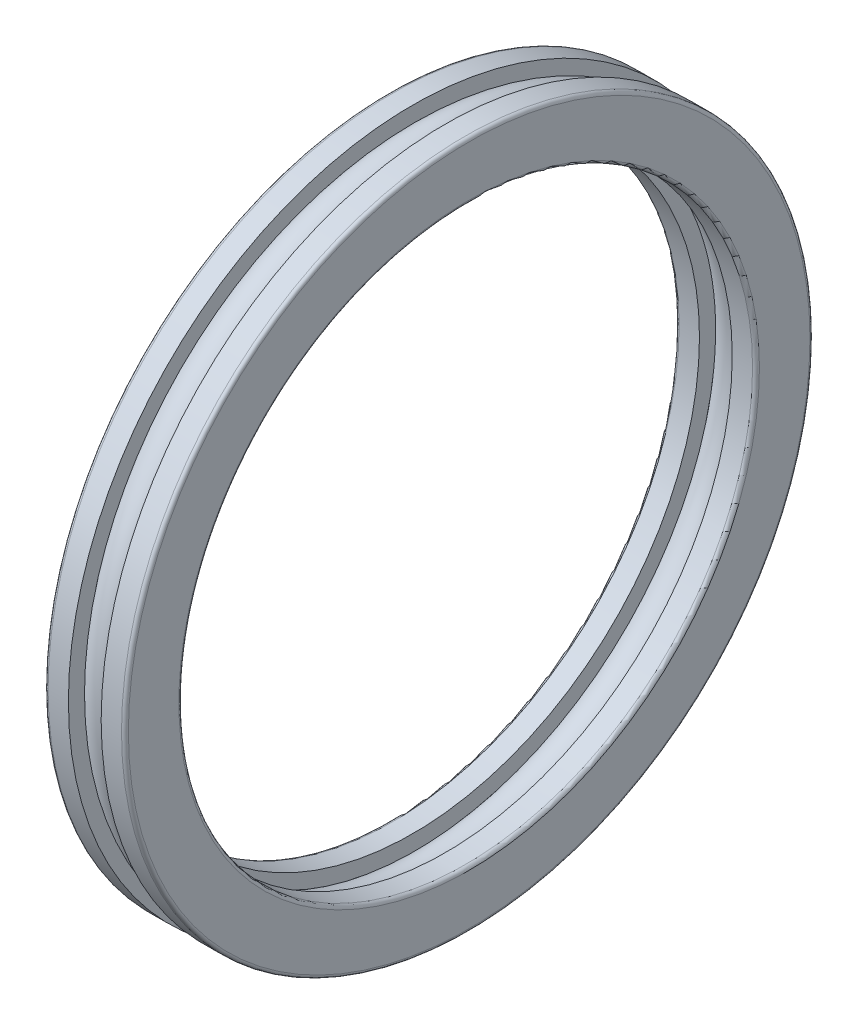
ISO-10303-21;
HEADER;
FILE_DESCRIPTION(('STEP AP214'),'2;1');
FILE_NAME('part.step','',(''),(''),'','','');
FILE_SCHEMA(('AUTOMOTIVE_DESIGN { 1 0 10303 214 1 1 1 1 }'));
ENDSEC;
DATA;
#1=APPLICATION_CONTEXT('core data for automotive mechanical design processes');
#2=APPLICATION_PROTOCOL_DEFINITION('international standard','automotive_design',2000,#1);
#3=PRODUCT_CONTEXT('',#1,'mechanical');
#4=PRODUCT('Part','Part','',(#3));
#5=PRODUCT_RELATED_PRODUCT_CATEGORY('part','',(#4));
#6=PRODUCT_DEFINITION_FORMATION('','',#4);
#7=PRODUCT_DEFINITION_CONTEXT('part definition',#1,'design');
#8=PRODUCT_DEFINITION('design','',#6,#7);
#9=PRODUCT_DEFINITION_SHAPE('','',#8);
#10=(LENGTH_UNIT() NAMED_UNIT(*) SI_UNIT(.MILLI.,.METRE.));
#11=(NAMED_UNIT(*) PLANE_ANGLE_UNIT() SI_UNIT($,.RADIAN.));
#12=(NAMED_UNIT(*) SI_UNIT($,.STERADIAN.) SOLID_ANGLE_UNIT());
#13=UNCERTAINTY_MEASURE_WITH_UNIT(LENGTH_MEASURE(1.E-05),#10,'distance_accuracy_value','');
#14=(GEOMETRIC_REPRESENTATION_CONTEXT(3) GLOBAL_UNCERTAINTY_ASSIGNED_CONTEXT((#13)) GLOBAL_UNIT_ASSIGNED_CONTEXT((#10,
#11,#12)) REPRESENTATION_CONTEXT('',''));
#15=CARTESIAN_POINT('',(0.,0.,0.));
#16=DIRECTION('',(0.,0.,1.));
#17=DIRECTION('',(1.,0.,0.));
#18=AXIS2_PLACEMENT_3D('',#15,#16,#17);
#19=CARTESIAN_POINT('',(0.,0.,0.));
#20=DIRECTION('',(-1.,0.,0.));
#21=DIRECTION('',(0.,0.,1.));
#22=AXIS2_PLACEMENT_3D('',#19,#20,#21);
#23=TOROIDAL_SURFACE('',#22,55.,3.57);
#24=CARTESIAN_POINT('',(2.856,0.,0.));
#25=DIRECTION('',(-1.,0.,0.));
#26=DIRECTION('',(0.,0.,1.));
#27=AXIS2_PLACEMENT_3D('',#24,#25,#26);
#28=CIRCLE('',#27,57.142);
#29=CARTESIAN_POINT('',(2.856,0.,57.142));
#30=VERTEX_POINT('',#29);
#31=EDGE_CURVE('E41',#30,#30,#28,.T.);
#32=ORIENTED_EDGE('',*,*,#31,.T.);
#33=EDGE_LOOP('',(#32));
#34=FACE_BOUND('',#33,.T.);
#35=CARTESIAN_POINT('',(-2.856,0.,0.));
#36=DIRECTION('',(1.,0.,0.));
#37=DIRECTION('',(0.,0.,-1.));
#38=AXIS2_PLACEMENT_3D('',#35,#36,#37);
#39=CIRCLE('',#38,57.142);
#40=CARTESIAN_POINT('',(-2.856,0.,-57.142));
#41=VERTEX_POINT('',#40);
#42=EDGE_CURVE('E56',#41,#41,#39,.F.);
#43=ORIENTED_EDGE('',*,*,#42,.F.);
#44=EDGE_LOOP('',(#43));
#45=FACE_BOUND('',#44,.T.);
#46=ADVANCED_FACE('F37',(#34,#45),#23,.T.);
#47=CARTESIAN_POINT('',(-2.856,52.8999311916035,0.));
#48=DIRECTION('',(1.,0.,0.));
#49=DIRECTION('',(0.,0.,-1.));
#50=AXIS2_PLACEMENT_3D('',#47,#48,#49);
#51=PLANE('',#50);
#52=CARTESIAN_POINT('',(-2.856,0.,0.));
#53=DIRECTION('',(1.,0.,0.));
#54=DIRECTION('',(0.,0.,-1.));
#55=AXIS2_PLACEMENT_3D('',#52,#53,#54);
#56=CIRCLE('',#55,50.);
#57=CARTESIAN_POINT('',(-2.856,0.,-50.));
#58=VERTEX_POINT('',#57);
#59=EDGE_CURVE('E75',#58,#58,#56,.T.);
#60=ORIENTED_EDGE('',*,*,#59,.F.);
#61=EDGE_LOOP('',(#60));
#62=FACE_BOUND('',#61,.T.);
#63=CARTESIAN_POINT('',(-2.856,0.,0.));
#64=DIRECTION('',(-1.,0.,0.));
#65=DIRECTION('',(0.,0.,1.));
#66=AXIS2_PLACEMENT_3D('',#63,#64,#65);
#67=CIRCLE('',#66,52.858);
#68=CARTESIAN_POINT('',(-2.856,0.,52.858));
#69=VERTEX_POINT('',#68);
#70=EDGE_CURVE('E54',#69,#69,#67,.F.);
#71=ORIENTED_EDGE('',*,*,#70,.T.);
#72=EDGE_LOOP('',(#71));
#73=FACE_BOUND('',#72,.T.);
#74=ADVANCED_FACE('F104',(#62,#73),#51,.T.);
#75=CARTESIAN_POINT('',(-2.856,60.,0.));
#76=DIRECTION('',(1.,0.,0.));
#77=DIRECTION('',(0.,0.,-1.));
#78=AXIS2_PLACEMENT_3D('',#75,#76,#77);
#79=PLANE('',#78);
#80=ORIENTED_EDGE('',*,*,#42,.T.);
#81=EDGE_LOOP('',(#80));
#82=FACE_BOUND('',#81,.T.);
#83=CARTESIAN_POINT('',(-2.856,0.,0.));
#84=DIRECTION('',(1.,0.,0.));
#85=DIRECTION('',(0.,0.,-1.));
#86=AXIS2_PLACEMENT_3D('',#83,#84,#85);
#87=CIRCLE('',#86,60.);
#88=CARTESIAN_POINT('',(-2.856,0.,-60.));
#89=VERTEX_POINT('',#88);
#90=EDGE_CURVE('E10',#89,#89,#87,.T.);
#91=ORIENTED_EDGE('',*,*,#90,.T.);
#92=EDGE_LOOP('',(#91));
#93=FACE_BOUND('',#92,.T.);
#94=ADVANCED_FACE('F39',(#82,#93),#79,.T.);
#95=CARTESIAN_POINT('',(-34.925,0.,0.));
#96=DIRECTION('',(1.,0.,0.));
#97=DIRECTION('',(0.,0.,-1.));
#98=AXIS2_PLACEMENT_3D('',#95,#96,#97);
#99=CYLINDRICAL_SURFACE('',#98,60.);
#100=CARTESIAN_POINT('',(-6.4,0.,0.));
#101=DIRECTION('',(1.,0.,0.));
#102=DIRECTION('',(0.,0.,-1.));
#103=AXIS2_PLACEMENT_3D('',#100,#101,#102);
#104=CIRCLE('',#103,60.);
#105=CARTESIAN_POINT('',(-6.4,0.,-60.));
#106=VERTEX_POINT('',#105);
#107=EDGE_CURVE('E45',#106,#106,#104,.T.);
#108=ORIENTED_EDGE('',*,*,#107,.T.);
#109=EDGE_LOOP('',(#108));
#110=FACE_BOUND('',#109,.T.);
#111=ORIENTED_EDGE('',*,*,#90,.F.);
#112=EDGE_LOOP('',(#111));
#113=FACE_BOUND('',#112,.T.);
#114=ADVANCED_FACE('F101',(#110,#113),#99,.T.);
#115=CARTESIAN_POINT('',(-6.4,0.,0.));
#116=DIRECTION('',(1.,0.,0.));
#117=DIRECTION('',(0.,0.,-1.));
#118=AXIS2_PLACEMENT_3D('',#115,#116,#117);
#119=TOROIDAL_SURFACE('',#118,59.4,0.599999999999998);
#120=CARTESIAN_POINT('',(-7.,0.,0.));
#121=DIRECTION('',(1.,0.,0.));
#122=DIRECTION('',(0.,0.,-1.));
#123=AXIS2_PLACEMENT_3D('',#120,#121,#122);
#124=CIRCLE('',#123,59.4);
#125=CARTESIAN_POINT('',(-7.,0.,-59.4));
#126=VERTEX_POINT('',#125);
#127=EDGE_CURVE('E50',#126,#126,#124,.T.);
#128=ORIENTED_EDGE('',*,*,#127,.T.);
#129=EDGE_LOOP('',(#128));
#130=FACE_BOUND('',#129,.T.);
#131=ORIENTED_EDGE('',*,*,#107,.F.);
#132=EDGE_LOOP('',(#131));
#133=FACE_BOUND('',#132,.T.);
#134=ADVANCED_FACE('F86',(#130,#133),#119,.T.);
#135=CARTESIAN_POINT('',(-7.,50.6,0.));
#136=DIRECTION('',(-1.,0.,0.));
#137=DIRECTION('',(0.,0.,1.));
#138=AXIS2_PLACEMENT_3D('',#135,#136,#137);
#139=PLANE('',#138);
#140=CARTESIAN_POINT('',(-7.,0.,0.));
#141=DIRECTION('',(1.,0.,0.));
#142=DIRECTION('',(0.,0.,-1.));
#143=AXIS2_PLACEMENT_3D('',#140,#141,#142);
#144=CIRCLE('',#143,50.6);
#145=CARTESIAN_POINT('',(-7.,0.,-50.6));
#146=VERTEX_POINT('',#145);
#147=EDGE_CURVE('E81',#146,#146,#144,.T.);
#148=ORIENTED_EDGE('',*,*,#147,.T.);
#149=EDGE_LOOP('',(#148));
#150=FACE_BOUND('',#149,.T.);
#151=ORIENTED_EDGE('',*,*,#127,.F.);
#152=EDGE_LOOP('',(#151));
#153=FACE_BOUND('',#152,.T.);
#154=ADVANCED_FACE('F89',(#150,#153),#139,.T.);
#155=CARTESIAN_POINT('',(-6.4,0.,0.));
#156=DIRECTION('',(1.,0.,0.));
#157=DIRECTION('',(0.,0.,-1.));
#158=AXIS2_PLACEMENT_3D('',#155,#156,#157);
#159=TOROIDAL_SURFACE('',#158,50.6,0.600000000000002);
#160=CARTESIAN_POINT('',(-6.4,0.,0.));
#161=DIRECTION('',(1.,0.,0.));
#162=DIRECTION('',(0.,0.,-1.));
#163=AXIS2_PLACEMENT_3D('',#160,#161,#162);
#164=CIRCLE('',#163,50.);
#165=CARTESIAN_POINT('',(-6.4,0.,-50.));
#166=VERTEX_POINT('',#165);
#167=EDGE_CURVE('E78',#166,#166,#164,.T.);
#168=ORIENTED_EDGE('',*,*,#167,.T.);
#169=EDGE_LOOP('',(#168));
#170=FACE_BOUND('',#169,.T.);
#171=ORIENTED_EDGE('',*,*,#147,.F.);
#172=EDGE_LOOP('',(#171));
#173=FACE_BOUND('',#172,.T.);
#174=ADVANCED_FACE('F91',(#170,#173),#159,.T.);
#175=CARTESIAN_POINT('',(-34.925,0.,0.));
#176=DIRECTION('',(1.,0.,0.));
#177=DIRECTION('',(0.,0.,-1.));
#178=AXIS2_PLACEMENT_3D('',#175,#176,#177);
#179=CYLINDRICAL_SURFACE('',#178,50.);
#180=ORIENTED_EDGE('',*,*,#59,.T.);
#181=EDGE_LOOP('',(#180));
#182=FACE_BOUND('',#181,.T.);
#183=ORIENTED_EDGE('',*,*,#167,.F.);
#184=EDGE_LOOP('',(#183));
#185=FACE_BOUND('',#184,.T.);
#186=ADVANCED_FACE('F98',(#182,#185),#179,.F.);
#187=CARTESIAN_POINT('',(2.856,0.,0.));
#188=DIRECTION('',(1.,0.,0.));
#189=DIRECTION('',(0.,0.,-1.));
#190=AXIS2_PLACEMENT_3D('',#187,#188,#189);
#191=CIRCLE('',#190,52.858);
#192=CARTESIAN_POINT('',(2.856,0.,-52.858));
#193=VERTEX_POINT('',#192);
#194=EDGE_CURVE('E57',#193,#193,#191,.T.);
#195=ORIENTED_EDGE('',*,*,#194,.T.);
#196=EDGE_LOOP('',(#195));
#197=FACE_BOUND('',#196,.T.);
#198=ORIENTED_EDGE('',*,*,#70,.F.);
#199=EDGE_LOOP('',(#198));
#200=FACE_BOUND('',#199,.T.);
#201=ADVANCED_FACE('F107',(#197,#200),#23,.T.);
#202=CARTESIAN_POINT('',(2.856,52.8999311916035,0.));
#203=DIRECTION('',(-1.,0.,0.));
#204=DIRECTION('',(0.,0.,-1.));
#205=AXIS2_PLACEMENT_3D('',#202,#203,#204);
#206=PLANE('',#205);
#207=CARTESIAN_POINT('',(2.856,0.,0.));
#208=DIRECTION('',(1.,0.,0.));
#209=DIRECTION('',(0.,0.,-1.));
#210=AXIS2_PLACEMENT_3D('',#207,#208,#209);
#211=CIRCLE('',#210,50.);
#212=CARTESIAN_POINT('',(2.856,0.,-50.));
#213=VERTEX_POINT('',#212);
#214=EDGE_CURVE('E256',#213,#213,#211,.T.);
#215=ORIENTED_EDGE('',*,*,#214,.T.);
#216=EDGE_LOOP('',(#215));
#217=FACE_BOUND('',#216,.T.);
#218=ORIENTED_EDGE('',*,*,#194,.F.);
#219=EDGE_LOOP('',(#218));
#220=FACE_BOUND('',#219,.T.);
#221=ADVANCED_FACE('F117',(#217,#220),#206,.T.);
#222=CARTESIAN_POINT('',(2.856,60.,0.));
#223=DIRECTION('',(-1.,0.,0.));
#224=DIRECTION('',(0.,0.,-1.));
#225=AXIS2_PLACEMENT_3D('',#222,#223,#224);
#226=PLANE('',#225);
#227=ORIENTED_EDGE('',*,*,#31,.F.);
#228=EDGE_LOOP('',(#227));
#229=FACE_BOUND('',#228,.T.);
#230=CARTESIAN_POINT('',(2.856,0.,0.));
#231=DIRECTION('',(1.,0.,0.));
#232=DIRECTION('',(0.,0.,-1.));
#233=AXIS2_PLACEMENT_3D('',#230,#231,#232);
#234=CIRCLE('',#233,60.);
#235=CARTESIAN_POINT('',(2.856,0.,-60.));
#236=VERTEX_POINT('',#235);
#237=EDGE_CURVE('E59',#236,#236,#234,.T.);
#238=ORIENTED_EDGE('',*,*,#237,.F.);
#239=EDGE_LOOP('',(#238));
#240=FACE_BOUND('',#239,.T.);
#241=ADVANCED_FACE('F121',(#229,#240),#226,.T.);
#242=CARTESIAN_POINT('',(34.925,0.,0.));
#243=DIRECTION('',(-1.,0.,0.));
#244=DIRECTION('',(0.,0.,-1.));
#245=AXIS2_PLACEMENT_3D('',#242,#243,#244);
#246=CYLINDRICAL_SURFACE('',#245,60.);
#247=CARTESIAN_POINT('',(6.4,0.,0.));
#248=DIRECTION('',(1.,0.,0.));
#249=DIRECTION('',(0.,0.,-1.));
#250=AXIS2_PLACEMENT_3D('',#247,#248,#249);
#251=CIRCLE('',#250,60.);
#252=CARTESIAN_POINT('',(6.4,0.,-60.));
#253=VERTEX_POINT('',#252);
#254=EDGE_CURVE('E64',#253,#253,#251,.T.);
#255=ORIENTED_EDGE('',*,*,#254,.F.);
#256=EDGE_LOOP('',(#255));
#257=FACE_BOUND('',#256,.T.);
#258=ORIENTED_EDGE('',*,*,#237,.T.);
#259=EDGE_LOOP('',(#258));
#260=FACE_BOUND('',#259,.T.);
#261=ADVANCED_FACE('F199',(#257,#260),#246,.T.);
#262=CARTESIAN_POINT('',(6.4,0.,0.));
#263=DIRECTION('',(-1.,0.,0.));
#264=DIRECTION('',(0.,0.,-1.));
#265=AXIS2_PLACEMENT_3D('',#262,#263,#264);
#266=TOROIDAL_SURFACE('',#265,59.4,0.599999999999998);
#267=CARTESIAN_POINT('',(7.,0.,0.));
#268=DIRECTION('',(1.,0.,0.));
#269=DIRECTION('',(0.,0.,-1.));
#270=AXIS2_PLACEMENT_3D('',#267,#268,#269);
#271=CIRCLE('',#270,59.4);
#272=CARTESIAN_POINT('',(7.,0.,-59.4));
#273=VERTEX_POINT('',#272);
#274=EDGE_CURVE('E69',#273,#273,#271,.T.);
#275=ORIENTED_EDGE('',*,*,#274,.F.);
#276=EDGE_LOOP('',(#275));
#277=FACE_BOUND('',#276,.T.);
#278=ORIENTED_EDGE('',*,*,#254,.T.);
#279=EDGE_LOOP('',(#278));
#280=FACE_BOUND('',#279,.T.);
#281=ADVANCED_FACE('F207',(#277,#280),#266,.T.);
#282=CARTESIAN_POINT('',(7.,50.6,0.));
#283=DIRECTION('',(1.,0.,0.));
#284=DIRECTION('',(0.,0.,1.));
#285=AXIS2_PLACEMENT_3D('',#282,#283,#284);
#286=PLANE('',#285);
#287=CARTESIAN_POINT('',(7.,0.,0.));
#288=DIRECTION('',(1.,0.,0.));
#289=DIRECTION('',(0.,0.,-1.));
#290=AXIS2_PLACEMENT_3D('',#287,#288,#289);
#291=CIRCLE('',#290,50.6);
#292=CARTESIAN_POINT('',(7.,0.,-50.6));
#293=VERTEX_POINT('',#292);
#294=EDGE_CURVE('E260',#293,#293,#291,.T.);
#295=ORIENTED_EDGE('',*,*,#294,.F.);
#296=EDGE_LOOP('',(#295));
#297=FACE_BOUND('',#296,.T.);
#298=ORIENTED_EDGE('',*,*,#274,.T.);
#299=EDGE_LOOP('',(#298));
#300=FACE_BOUND('',#299,.T.);
#301=ADVANCED_FACE('F216',(#297,#300),#286,.T.);
#302=CARTESIAN_POINT('',(6.4,0.,0.));
#303=DIRECTION('',(-1.,0.,0.));
#304=DIRECTION('',(0.,0.,-1.));
#305=AXIS2_PLACEMENT_3D('',#302,#303,#304);
#306=TOROIDAL_SURFACE('',#305,50.6,0.600000000000002);
#307=CARTESIAN_POINT('',(6.4,0.,0.));
#308=DIRECTION('',(1.,0.,0.));
#309=DIRECTION('',(0.,0.,-1.));
#310=AXIS2_PLACEMENT_3D('',#307,#308,#309);
#311=CIRCLE('',#310,50.);
#312=CARTESIAN_POINT('',(6.4,0.,-50.));
#313=VERTEX_POINT('',#312);
#314=EDGE_CURVE('E259',#313,#313,#311,.T.);
#315=ORIENTED_EDGE('',*,*,#314,.F.);
#316=EDGE_LOOP('',(#315));
#317=FACE_BOUND('',#316,.T.);
#318=ORIENTED_EDGE('',*,*,#294,.T.);
#319=EDGE_LOOP('',(#318));
#320=FACE_BOUND('',#319,.T.);
#321=ADVANCED_FACE('F225',(#317,#320),#306,.T.);
#322=CARTESIAN_POINT('',(34.925,0.,0.));
#323=DIRECTION('',(-1.,0.,0.));
#324=DIRECTION('',(0.,0.,-1.));
#325=AXIS2_PLACEMENT_3D('',#322,#323,#324);
#326=CYLINDRICAL_SURFACE('',#325,50.);
#327=ORIENTED_EDGE('',*,*,#214,.F.);
#328=EDGE_LOOP('',(#327));
#329=FACE_BOUND('',#328,.T.);
#330=ORIENTED_EDGE('',*,*,#314,.T.);
#331=EDGE_LOOP('',(#330));
#332=FACE_BOUND('',#331,.T.);
#333=ADVANCED_FACE('F234',(#329,#332),#326,.F.);
#334=CLOSED_SHELL('',(#46,#74,#94,#114,#134,#154,#174,#186,#201,#221,#241,#261,#281,#301,#321,#333));
#335=MANIFOLD_SOLID_BREP('B2',#334);
#336=ADVANCED_BREP_SHAPE_REPRESENTATION('',(#18,#335),#14);
#337=SHAPE_DEFINITION_REPRESENTATION(#9,#336);
ENDSEC;
END-ISO-10303-21;
